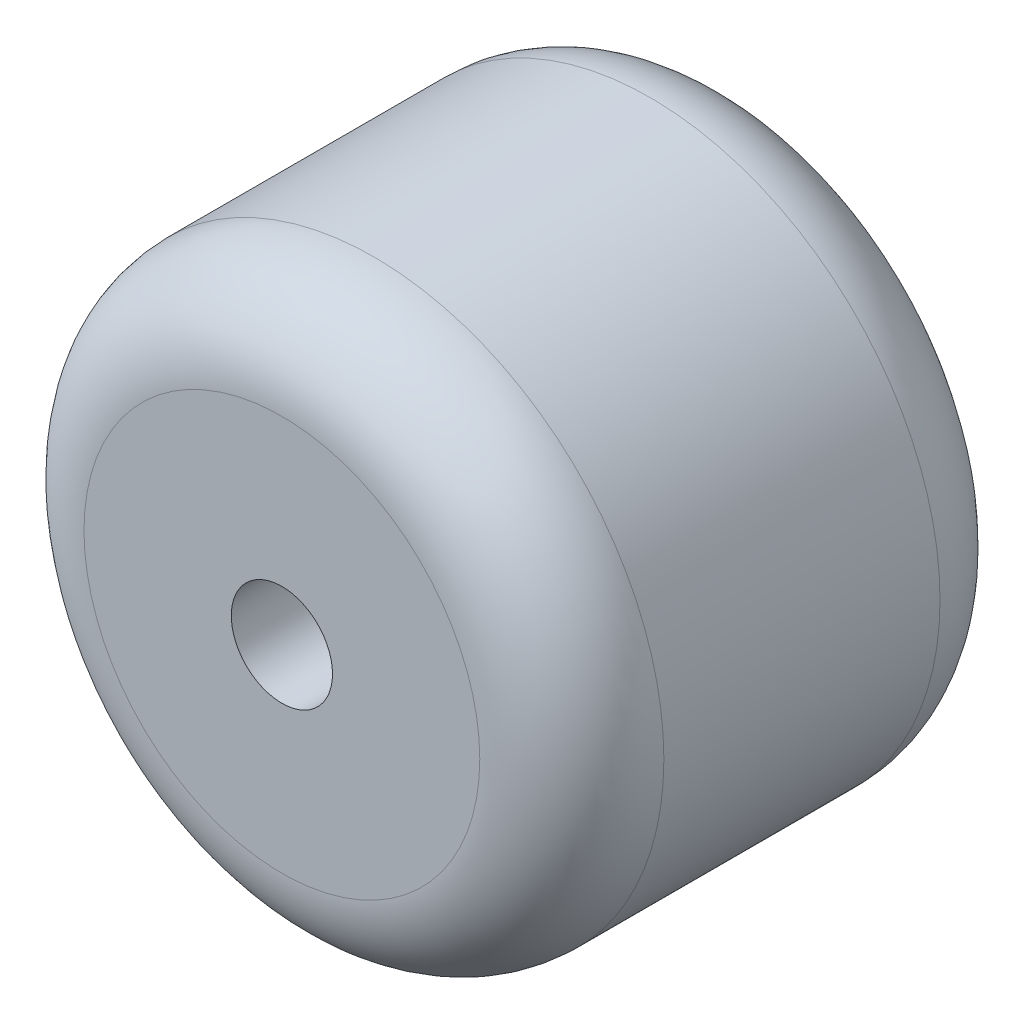
ISO-10303-21;
HEADER;
FILE_DESCRIPTION(('STEP AP214'),'2;1');
FILE_NAME('part.step','',(''),(''),'','','');
FILE_SCHEMA(('AUTOMOTIVE_DESIGN { 1 0 10303 214 1 1 1 1 }'));
ENDSEC;
DATA;
#1=APPLICATION_CONTEXT('core data for automotive mechanical design processes');
#2=APPLICATION_PROTOCOL_DEFINITION('international standard','automotive_design',2000,#1);
#3=PRODUCT_CONTEXT('',#1,'mechanical');
#4=PRODUCT('Part','Part','',(#3));
#5=PRODUCT_RELATED_PRODUCT_CATEGORY('part','',(#4));
#6=PRODUCT_DEFINITION_FORMATION('','',#4);
#7=PRODUCT_DEFINITION_CONTEXT('part definition',#1,'design');
#8=PRODUCT_DEFINITION('design','',#6,#7);
#9=PRODUCT_DEFINITION_SHAPE('','',#8);
#10=(LENGTH_UNIT() NAMED_UNIT(*) SI_UNIT(.MILLI.,.METRE.));
#11=(NAMED_UNIT(*) PLANE_ANGLE_UNIT() SI_UNIT($,.RADIAN.));
#12=(NAMED_UNIT(*) SI_UNIT($,.STERADIAN.) SOLID_ANGLE_UNIT());
#13=UNCERTAINTY_MEASURE_WITH_UNIT(LENGTH_MEASURE(1.E-05),#10,'distance_accuracy_value','');
#14=(GEOMETRIC_REPRESENTATION_CONTEXT(3) GLOBAL_UNCERTAINTY_ASSIGNED_CONTEXT((#13)) GLOBAL_UNIT_ASSIGNED_CONTEXT((#10,
#11,#12)) REPRESENTATION_CONTEXT('',''));
#15=CARTESIAN_POINT('',(0.,0.,0.));
#16=DIRECTION('',(0.,0.,1.));
#17=DIRECTION('',(1.,0.,0.));
#18=AXIS2_PLACEMENT_3D('',#15,#16,#17);
#19=CARTESIAN_POINT('',(0.,0.,25.));
#20=DIRECTION('',(0.,0.,1.));
#21=DIRECTION('',(1.,0.,0.));
#22=AXIS2_PLACEMENT_3D('',#19,#20,#21);
#23=PLANE('',#22);
#24=CARTESIAN_POINT('',(0.,0.,25.));
#25=DIRECTION('',(0.,0.,1.));
#26=DIRECTION('',(1.,0.,0.));
#27=AXIS2_PLACEMENT_3D('',#24,#25,#26);
#28=CIRCLE('',#27,10.75);
#29=CARTESIAN_POINT('',(10.75,0.,25.));
#30=VERTEX_POINT('',#29);
#31=EDGE_CURVE('E66',#30,#30,#28,.T.);
#32=ORIENTED_EDGE('',*,*,#31,.T.);
#33=EDGE_LOOP('',(#32));
#34=FACE_BOUND('',#33,.T.);
#35=CARTESIAN_POINT('',(0.,0.,25.));
#36=DIRECTION('',(0.,0.,1.));
#37=DIRECTION('',(1.,0.,0.));
#38=AXIS2_PLACEMENT_3D('',#35,#36,#37);
#39=CIRCLE('',#38,2.75);
#40=CARTESIAN_POINT('',(2.75,0.,25.));
#41=VERTEX_POINT('',#40);
#42=EDGE_CURVE('E71',#41,#41,#39,.T.);
#43=ORIENTED_EDGE('',*,*,#42,.F.);
#44=EDGE_LOOP('',(#43));
#45=FACE_BOUND('',#44,.T.);
#46=ADVANCED_FACE('F45',(#34,#45),#23,.T.);
#47=CARTESIAN_POINT('',(0.,0.,0.));
#48=DIRECTION('',(0.,0.,1.));
#49=DIRECTION('',(1.,0.,0.));
#50=AXIS2_PLACEMENT_3D('',#47,#48,#49);
#51=PLANE('',#50);
#52=CARTESIAN_POINT('',(0.,0.,0.));
#53=DIRECTION('',(0.,0.,1.));
#54=DIRECTION('',(1.,0.,0.));
#55=AXIS2_PLACEMENT_3D('',#52,#53,#54);
#56=CIRCLE('',#55,10.75);
#57=CARTESIAN_POINT('',(10.75,0.,0.));
#58=VERTEX_POINT('',#57);
#59=EDGE_CURVE('E10',#58,#58,#56,.F.);
#60=ORIENTED_EDGE('',*,*,#59,.T.);
#61=EDGE_LOOP('',(#60));
#62=FACE_BOUND('',#61,.T.);
#63=CARTESIAN_POINT('',(0.,0.,0.));
#64=DIRECTION('',(0.,0.,1.));
#65=DIRECTION('',(1.,0.,0.));
#66=AXIS2_PLACEMENT_3D('',#63,#64,#65);
#67=CIRCLE('',#66,2.75);
#68=CARTESIAN_POINT('',(2.75,0.,0.));
#69=VERTEX_POINT('',#68);
#70=EDGE_CURVE('E72',#69,#69,#67,.T.);
#71=ORIENTED_EDGE('',*,*,#70,.T.);
#72=EDGE_LOOP('',(#71));
#73=FACE_BOUND('',#72,.T.);
#74=ADVANCED_FACE('F82',(#62,#73),#51,.F.);
#75=CARTESIAN_POINT('',(0.,0.,25.));
#76=DIRECTION('',(0.,0.,-1.));
#77=DIRECTION('',(-1.,0.,0.));
#78=AXIS2_PLACEMENT_3D('',#75,#76,#77);
#79=CYLINDRICAL_SURFACE('',#78,15.75);
#80=CARTESIAN_POINT('',(0.,0.,20.));
#81=DIRECTION('',(0.,0.,1.));
#82=DIRECTION('',(1.,0.,0.));
#83=AXIS2_PLACEMENT_3D('',#80,#81,#82);
#84=CIRCLE('',#83,15.75);
#85=CARTESIAN_POINT('',(15.75,0.,20.));
#86=VERTEX_POINT('',#85);
#87=EDGE_CURVE('E53',#86,#86,#84,.F.);
#88=ORIENTED_EDGE('',*,*,#87,.T.);
#89=EDGE_LOOP('',(#88));
#90=FACE_BOUND('',#89,.T.);
#91=CARTESIAN_POINT('',(0.,0.,5.));
#92=DIRECTION('',(0.,0.,1.));
#93=DIRECTION('',(1.,0.,0.));
#94=AXIS2_PLACEMENT_3D('',#91,#92,#93);
#95=CIRCLE('',#94,15.75);
#96=CARTESIAN_POINT('',(15.75,0.,5.));
#97=VERTEX_POINT('',#96);
#98=EDGE_CURVE('E60',#97,#97,#95,.T.);
#99=ORIENTED_EDGE('',*,*,#98,.T.);
#100=EDGE_LOOP('',(#99));
#101=FACE_BOUND('',#100,.T.);
#102=ADVANCED_FACE('F88',(#90,#101),#79,.T.);
#103=CARTESIAN_POINT('',(0.,0.,25.));
#104=DIRECTION('',(0.,0.,-1.));
#105=DIRECTION('',(-1.,0.,0.));
#106=AXIS2_PLACEMENT_3D('',#103,#104,#105);
#107=CYLINDRICAL_SURFACE('',#106,2.75);
#108=ORIENTED_EDGE('',*,*,#42,.T.);
#109=EDGE_LOOP('',(#108));
#110=FACE_BOUND('',#109,.T.);
#111=ORIENTED_EDGE('',*,*,#70,.F.);
#112=EDGE_LOOP('',(#111));
#113=FACE_BOUND('',#112,.T.);
#114=ADVANCED_FACE('F78',(#110,#113),#107,.F.);
#115=CARTESIAN_POINT('',(0.,0.,20.));
#116=DIRECTION('',(0.,0.,1.));
#117=DIRECTION('',(1.,0.,0.));
#118=AXIS2_PLACEMENT_3D('',#115,#116,#117);
#119=TOROIDAL_SURFACE('',#118,10.75,5.);
#120=ORIENTED_EDGE('',*,*,#87,.F.);
#121=EDGE_LOOP('',(#120));
#122=FACE_BOUND('',#121,.T.);
#123=ORIENTED_EDGE('',*,*,#31,.F.);
#124=EDGE_LOOP('',(#123));
#125=FACE_BOUND('',#124,.T.);
#126=ADVANCED_FACE('F93',(#122,#125),#119,.T.);
#127=CARTESIAN_POINT('',(0.,0.,5.));
#128=DIRECTION('',(0.,0.,1.));
#129=DIRECTION('',(1.,0.,0.));
#130=AXIS2_PLACEMENT_3D('',#127,#128,#129);
#131=TOROIDAL_SURFACE('',#130,10.75,5.);
#132=ORIENTED_EDGE('',*,*,#59,.F.);
#133=EDGE_LOOP('',(#132));
#134=FACE_BOUND('',#133,.T.);
#135=ORIENTED_EDGE('',*,*,#98,.F.);
#136=EDGE_LOOP('',(#135));
#137=FACE_BOUND('',#136,.T.);
#138=ADVANCED_FACE('F47',(#134,#137),#131,.T.);
#139=CLOSED_SHELL('',(#46,#74,#102,#114,#126,#138));
#140=MANIFOLD_SOLID_BREP('B2',#139);
#141=ADVANCED_BREP_SHAPE_REPRESENTATION('',(#18,#140),#14);
#142=SHAPE_DEFINITION_REPRESENTATION(#9,#141);
ENDSEC;
END-ISO-10303-21;
